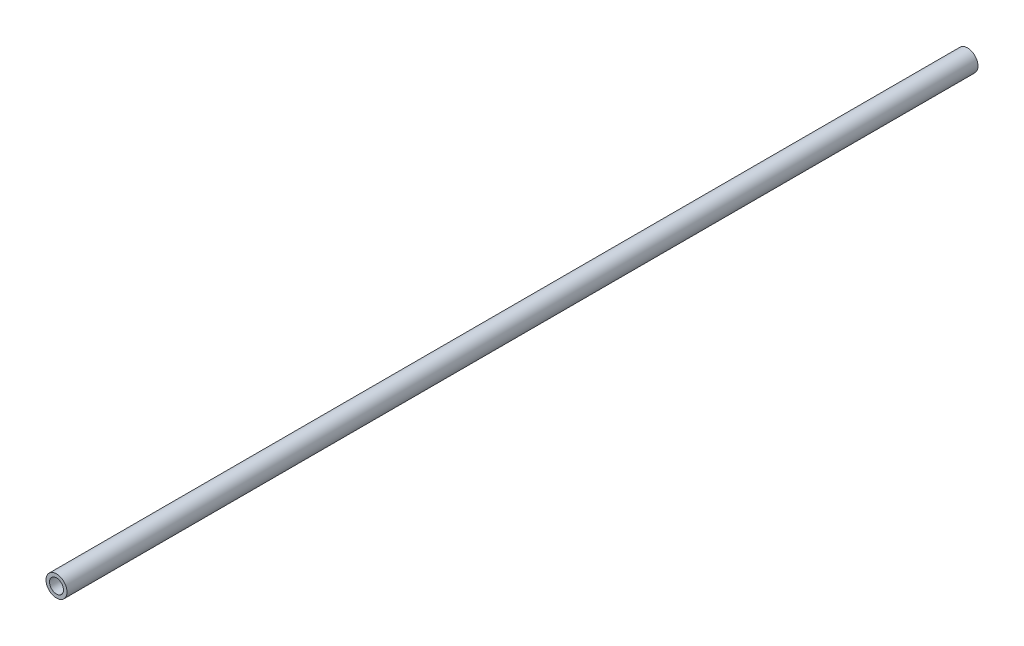
ISO-10303-21;
HEADER;
FILE_DESCRIPTION(('STEP AP214'),'2;1');
FILE_NAME('part.step','',(''),(''),'','','');
FILE_SCHEMA(('AUTOMOTIVE_DESIGN { 1 0 10303 214 1 1 1 1 }'));
ENDSEC;
DATA;
#1=APPLICATION_CONTEXT('core data for automotive mechanical design processes');
#2=APPLICATION_PROTOCOL_DEFINITION('international standard','automotive_design',2000,#1);
#3=PRODUCT_CONTEXT('',#1,'mechanical');
#4=PRODUCT('Part','Part','',(#3));
#5=PRODUCT_RELATED_PRODUCT_CATEGORY('part','',(#4));
#6=PRODUCT_DEFINITION_FORMATION('','',#4);
#7=PRODUCT_DEFINITION_CONTEXT('part definition',#1,'design');
#8=PRODUCT_DEFINITION('design','',#6,#7);
#9=PRODUCT_DEFINITION_SHAPE('','',#8);
#10=(LENGTH_UNIT() NAMED_UNIT(*) SI_UNIT(.MILLI.,.METRE.));
#11=(NAMED_UNIT(*) PLANE_ANGLE_UNIT() SI_UNIT($,.RADIAN.));
#12=(NAMED_UNIT(*) SI_UNIT($,.STERADIAN.) SOLID_ANGLE_UNIT());
#13=UNCERTAINTY_MEASURE_WITH_UNIT(LENGTH_MEASURE(1.E-05),#10,'distance_accuracy_value','');
#14=(GEOMETRIC_REPRESENTATION_CONTEXT(3) GLOBAL_UNCERTAINTY_ASSIGNED_CONTEXT((#13)) GLOBAL_UNIT_ASSIGNED_CONTEXT((#10,
#11,#12)) REPRESENTATION_CONTEXT('',''));
#15=CARTESIAN_POINT('',(0.,0.,0.));
#16=DIRECTION('',(0.,0.,1.));
#17=DIRECTION('',(1.,0.,0.));
#18=AXIS2_PLACEMENT_3D('',#15,#16,#17);
#19=CARTESIAN_POINT('',(0.,0.,130.));
#20=DIRECTION('',(0.,0.,1.));
#21=DIRECTION('',(1.,0.,0.));
#22=AXIS2_PLACEMENT_3D('',#19,#20,#21);
#23=PLANE('',#22);
#24=CARTESIAN_POINT('',(0.,0.,130.));
#25=DIRECTION('',(0.,0.,1.));
#26=DIRECTION('',(1.,0.,0.));
#27=AXIS2_PLACEMENT_3D('',#24,#25,#26);
#28=CIRCLE('',#27,3.);
#29=CARTESIAN_POINT('',(3.,0.,130.));
#30=VERTEX_POINT('',#29);
#31=EDGE_CURVE('E10',#30,#30,#28,.T.);
#32=ORIENTED_EDGE('',*,*,#31,.T.);
#33=EDGE_LOOP('',(#32));
#34=FACE_BOUND('',#33,.T.);
#35=CARTESIAN_POINT('',(0.,0.,130.));
#36=DIRECTION('',(0.,0.,1.));
#37=DIRECTION('',(1.,0.,0.));
#38=AXIS2_PLACEMENT_3D('',#35,#36,#37);
#39=CIRCLE('',#38,2.);
#40=CARTESIAN_POINT('',(2.,0.,130.));
#41=VERTEX_POINT('',#40);
#42=EDGE_CURVE('E44',#41,#41,#39,.T.);
#43=ORIENTED_EDGE('',*,*,#42,.F.);
#44=EDGE_LOOP('',(#43));
#45=FACE_BOUND('',#44,.T.);
#46=ADVANCED_FACE('F33',(#34,#45),#23,.T.);
#47=CARTESIAN_POINT('',(0.,0.,-130.));
#48=DIRECTION('',(0.,0.,1.));
#49=DIRECTION('',(1.,0.,0.));
#50=AXIS2_PLACEMENT_3D('',#47,#48,#49);
#51=PLANE('',#50);
#52=CARTESIAN_POINT('',(0.,0.,-130.));
#53=DIRECTION('',(0.,0.,1.));
#54=DIRECTION('',(1.,0.,0.));
#55=AXIS2_PLACEMENT_3D('',#52,#53,#54);
#56=CIRCLE('',#55,3.);
#57=CARTESIAN_POINT('',(3.,0.,-130.));
#58=VERTEX_POINT('',#57);
#59=EDGE_CURVE('E37',#58,#58,#56,.T.);
#60=ORIENTED_EDGE('',*,*,#59,.F.);
#61=EDGE_LOOP('',(#60));
#62=FACE_BOUND('',#61,.T.);
#63=CARTESIAN_POINT('',(0.,0.,-130.));
#64=DIRECTION('',(0.,0.,1.));
#65=DIRECTION('',(1.,0.,0.));
#66=AXIS2_PLACEMENT_3D('',#63,#64,#65);
#67=CIRCLE('',#66,2.);
#68=CARTESIAN_POINT('',(2.,0.,-130.));
#69=VERTEX_POINT('',#68);
#70=EDGE_CURVE('E46',#69,#69,#67,.T.);
#71=ORIENTED_EDGE('',*,*,#70,.T.);
#72=EDGE_LOOP('',(#71));
#73=FACE_BOUND('',#72,.T.);
#74=ADVANCED_FACE('F56',(#62,#73),#51,.F.);
#75=CARTESIAN_POINT('',(0.,0.,130.));
#76=DIRECTION('',(0.,0.,-1.));
#77=DIRECTION('',(-1.,0.,0.));
#78=AXIS2_PLACEMENT_3D('',#75,#76,#77);
#79=CYLINDRICAL_SURFACE('',#78,3.);
#80=ORIENTED_EDGE('',*,*,#31,.F.);
#81=EDGE_LOOP('',(#80));
#82=FACE_BOUND('',#81,.T.);
#83=ORIENTED_EDGE('',*,*,#59,.T.);
#84=EDGE_LOOP('',(#83));
#85=FACE_BOUND('',#84,.T.);
#86=ADVANCED_FACE('F35',(#82,#85),#79,.T.);
#87=CARTESIAN_POINT('',(0.,0.,130.));
#88=DIRECTION('',(0.,0.,-1.));
#89=DIRECTION('',(-1.,0.,0.));
#90=AXIS2_PLACEMENT_3D('',#87,#88,#89);
#91=CYLINDRICAL_SURFACE('',#90,2.);
#92=ORIENTED_EDGE('',*,*,#42,.T.);
#93=EDGE_LOOP('',(#92));
#94=FACE_BOUND('',#93,.T.);
#95=ORIENTED_EDGE('',*,*,#70,.F.);
#96=EDGE_LOOP('',(#95));
#97=FACE_BOUND('',#96,.T.);
#98=ADVANCED_FACE('F52',(#94,#97),#91,.F.);
#99=CLOSED_SHELL('',(#46,#74,#86,#98));
#100=MANIFOLD_SOLID_BREP('B2',#99);
#101=ADVANCED_BREP_SHAPE_REPRESENTATION('',(#18,#100),#14);
#102=SHAPE_DEFINITION_REPRESENTATION(#9,#101);
ENDSEC;
END-ISO-10303-21;
